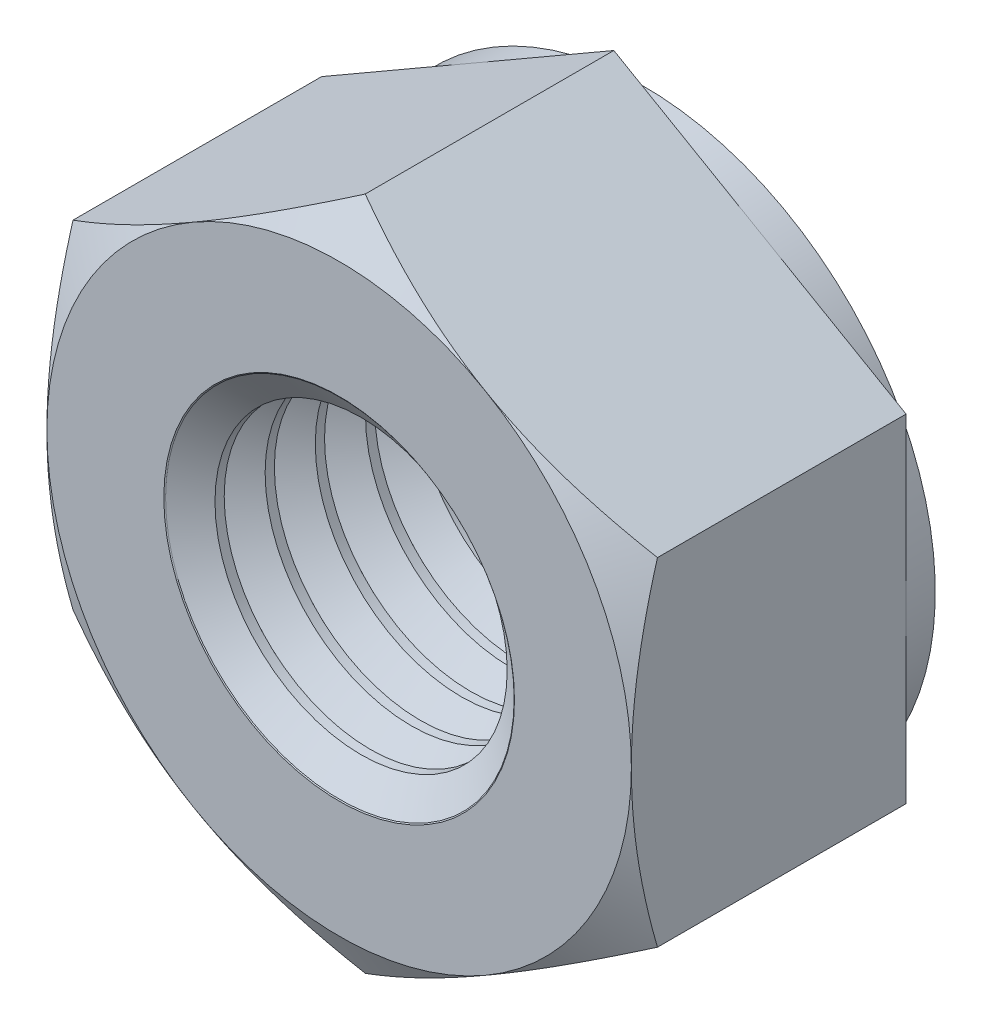
ISO-10303-21;
HEADER;
FILE_DESCRIPTION(('STEP AP214'),'2;1');
FILE_NAME('part.step','',(''),(''),'','','');
FILE_SCHEMA(('AUTOMOTIVE_DESIGN { 1 0 10303 214 1 1 1 1 }'));
ENDSEC;
DATA;
#1=APPLICATION_CONTEXT('core data for automotive mechanical design processes');
#2=APPLICATION_PROTOCOL_DEFINITION('international standard','automotive_design',2000,#1);
#3=PRODUCT_CONTEXT('',#1,'mechanical');
#4=PRODUCT('Part','Part','',(#3));
#5=PRODUCT_RELATED_PRODUCT_CATEGORY('part','',(#4));
#6=PRODUCT_DEFINITION_FORMATION('','',#4);
#7=PRODUCT_DEFINITION_CONTEXT('part definition',#1,'design');
#8=PRODUCT_DEFINITION('design','',#6,#7);
#9=PRODUCT_DEFINITION_SHAPE('','',#8);
#10=(LENGTH_UNIT() NAMED_UNIT(*) SI_UNIT(.MILLI.,.METRE.));
#11=(NAMED_UNIT(*) PLANE_ANGLE_UNIT() SI_UNIT($,.RADIAN.));
#12=(NAMED_UNIT(*) SI_UNIT($,.STERADIAN.) SOLID_ANGLE_UNIT());
#13=UNCERTAINTY_MEASURE_WITH_UNIT(LENGTH_MEASURE(1.E-05),#10,'distance_accuracy_value','');
#14=(GEOMETRIC_REPRESENTATION_CONTEXT(3) GLOBAL_UNCERTAINTY_ASSIGNED_CONTEXT((#13)) GLOBAL_UNIT_ASSIGNED_CONTEXT((#10,
#11,#12)) REPRESENTATION_CONTEXT('',''));
#15=CARTESIAN_POINT('',(0.,0.,0.));
#16=DIRECTION('',(0.,0.,1.));
#17=DIRECTION('',(1.,0.,0.));
#18=AXIS2_PLACEMENT_3D('',#15,#16,#17);
#19=CARTESIAN_POINT('',(0.,0.,-5.2));
#20=DIRECTION('',(0.,0.,1.));
#21=DIRECTION('',(1.,0.,0.));
#22=AXIS2_PLACEMENT_3D('',#19,#20,#21);
#23=CYLINDRICAL_SURFACE('',#22,2.5);
#24=CARTESIAN_POINT('',(0.,0.,-4.66650376910486));
#25=DIRECTION('',(0.,0.,-1.));
#26=DIRECTION('',(-1.,0.,0.));
#27=AXIS2_PLACEMENT_3D('',#24,#25,#26);
#28=CIRCLE('',#27,2.5);
#29=CARTESIAN_POINT('',(-2.5,0.,-4.66650376910486));
#30=VERTEX_POINT('',#29);
#31=EDGE_CURVE('E745',#30,#30,#28,.T.);
#32=ORIENTED_EDGE('',*,*,#31,.F.);
#33=EDGE_LOOP('',(#32));
#34=FACE_BOUND('',#33,.T.);
#35=CARTESIAN_POINT('',(0.,0.,-4.82449623089515));
#36=DIRECTION('',(0.,0.,-1.));
#37=DIRECTION('',(-1.,0.,0.));
#38=AXIS2_PLACEMENT_3D('',#35,#36,#37);
#39=CIRCLE('',#38,2.5);
#40=CARTESIAN_POINT('',(-2.5,0.,-4.82449623089515));
#41=VERTEX_POINT('',#40);
#42=EDGE_CURVE('E287',#41,#41,#39,.F.);
#43=ORIENTED_EDGE('',*,*,#42,.F.);
#44=EDGE_LOOP('',(#43));
#45=FACE_BOUND('',#44,.T.);
#46=ADVANCED_FACE('F41',(#34,#45),#23,.F.);
#47=CARTESIAN_POINT('',(0.,0.,-3.96629623089515));
#48=DIRECTION('',(0.,0.,-1.));
#49=DIRECTION('',(-1.,0.,0.));
#50=AXIS2_PLACEMENT_3D('',#47,#48,#49);
#51=CIRCLE('',#50,2.5);
#52=CARTESIAN_POINT('',(-2.5,0.,-3.96629623089515));
#53=VERTEX_POINT('',#52);
#54=EDGE_CURVE('E746',#53,#53,#51,.T.);
#55=ORIENTED_EDGE('',*,*,#54,.T.);
#56=EDGE_LOOP('',(#55));
#57=FACE_BOUND('',#56,.T.);
#58=CARTESIAN_POINT('',(0.,0.,-3.80830376910486));
#59=DIRECTION('',(0.,0.,-1.));
#60=DIRECTION('',(-1.,0.,0.));
#61=AXIS2_PLACEMENT_3D('',#58,#59,#60);
#62=CIRCLE('',#61,2.5);
#63=CARTESIAN_POINT('',(-2.5,0.,-3.80830376910486));
#64=VERTEX_POINT('',#63);
#65=EDGE_CURVE('E755',#64,#64,#62,.T.);
#66=ORIENTED_EDGE('',*,*,#65,.F.);
#67=EDGE_LOOP('',(#66));
#68=FACE_BOUND('',#67,.T.);
#69=ADVANCED_FACE('F241',(#57,#68),#23,.F.);
#70=CARTESIAN_POINT('',(0.,0.,-3.10809623089515));
#71=DIRECTION('',(0.,0.,-1.));
#72=DIRECTION('',(-1.,0.,0.));
#73=AXIS2_PLACEMENT_3D('',#70,#71,#72);
#74=CIRCLE('',#73,2.5);
#75=CARTESIAN_POINT('',(-2.5,0.,-3.10809623089515));
#76=VERTEX_POINT('',#75);
#77=EDGE_CURVE('E748',#76,#76,#74,.T.);
#78=ORIENTED_EDGE('',*,*,#77,.T.);
#79=EDGE_LOOP('',(#78));
#80=FACE_BOUND('',#79,.T.);
#81=CARTESIAN_POINT('',(0.,0.,-2.95010376910486));
#82=DIRECTION('',(0.,0.,-1.));
#83=DIRECTION('',(-1.,0.,0.));
#84=AXIS2_PLACEMENT_3D('',#81,#82,#83);
#85=CIRCLE('',#84,2.5);
#86=CARTESIAN_POINT('',(-2.5,0.,-2.95010376910486));
#87=VERTEX_POINT('',#86);
#88=EDGE_CURVE('E764',#87,#87,#85,.T.);
#89=ORIENTED_EDGE('',*,*,#88,.F.);
#90=EDGE_LOOP('',(#89));
#91=FACE_BOUND('',#90,.T.);
#92=ADVANCED_FACE('F248',(#80,#91),#23,.F.);
#93=CARTESIAN_POINT('',(0.,0.,-2.24989623089515));
#94=DIRECTION('',(0.,0.,-1.));
#95=DIRECTION('',(-1.,0.,0.));
#96=AXIS2_PLACEMENT_3D('',#93,#94,#95);
#97=CIRCLE('',#96,2.5);
#98=CARTESIAN_POINT('',(-2.5,0.,-2.24989623089515));
#99=VERTEX_POINT('',#98);
#100=EDGE_CURVE('E761',#99,#99,#97,.T.);
#101=ORIENTED_EDGE('',*,*,#100,.T.);
#102=EDGE_LOOP('',(#101));
#103=FACE_BOUND('',#102,.T.);
#104=CARTESIAN_POINT('',(0.,0.,-2.09190376910486));
#105=DIRECTION('',(0.,0.,-1.));
#106=DIRECTION('',(-1.,0.,0.));
#107=AXIS2_PLACEMENT_3D('',#104,#105,#106);
#108=CIRCLE('',#107,2.5);
#109=CARTESIAN_POINT('',(-2.5,0.,-2.09190376910486));
#110=VERTEX_POINT('',#109);
#111=EDGE_CURVE('E773',#110,#110,#108,.T.);
#112=ORIENTED_EDGE('',*,*,#111,.F.);
#113=EDGE_LOOP('',(#112));
#114=FACE_BOUND('',#113,.T.);
#115=ADVANCED_FACE('F262',(#103,#114),#23,.F.);
#116=CARTESIAN_POINT('',(0.,0.,-1.39169623089515));
#117=DIRECTION('',(0.,0.,-1.));
#118=DIRECTION('',(-1.,0.,0.));
#119=AXIS2_PLACEMENT_3D('',#116,#117,#118);
#120=CIRCLE('',#119,2.5);
#121=CARTESIAN_POINT('',(-2.5,0.,-1.39169623089515));
#122=VERTEX_POINT('',#121);
#123=EDGE_CURVE('E770',#122,#122,#120,.T.);
#124=ORIENTED_EDGE('',*,*,#123,.T.);
#125=EDGE_LOOP('',(#124));
#126=FACE_BOUND('',#125,.T.);
#127=CARTESIAN_POINT('',(0.,0.,-1.23370376910486));
#128=DIRECTION('',(0.,0.,-1.));
#129=DIRECTION('',(-1.,0.,0.));
#130=AXIS2_PLACEMENT_3D('',#127,#128,#129);
#131=CIRCLE('',#130,2.5);
#132=CARTESIAN_POINT('',(-2.5,0.,-1.23370376910486));
#133=VERTEX_POINT('',#132);
#134=EDGE_CURVE('E278',#133,#133,#131,.T.);
#135=ORIENTED_EDGE('',*,*,#134,.F.);
#136=EDGE_LOOP('',(#135));
#137=FACE_BOUND('',#136,.T.);
#138=ADVANCED_FACE('F254',(#126,#137),#23,.F.);
#139=CARTESIAN_POINT('',(0.,0.,-0.533496230895153));
#140=DIRECTION('',(0.,0.,-1.));
#141=DIRECTION('',(-1.,0.,0.));
#142=AXIS2_PLACEMENT_3D('',#139,#140,#141);
#143=CIRCLE('',#142,2.5);
#144=CARTESIAN_POINT('',(-2.5,0.,-0.533496230895153));
#145=VERTEX_POINT('',#144);
#146=EDGE_CURVE('E267',#145,#145,#143,.T.);
#147=ORIENTED_EDGE('',*,*,#146,.T.);
#148=EDGE_LOOP('',(#147));
#149=FACE_BOUND('',#148,.T.);
#150=CARTESIAN_POINT('',(0.,0.,-0.375503769104859));
#151=DIRECTION('',(0.,0.,-1.));
#152=DIRECTION('',(-1.,0.,0.));
#153=AXIS2_PLACEMENT_3D('',#150,#151,#152);
#154=CIRCLE('',#153,2.5);
#155=CARTESIAN_POINT('',(-2.5,0.,-0.375503769104859));
#156=VERTEX_POINT('',#155);
#157=EDGE_CURVE('E270',#156,#156,#154,.T.);
#158=ORIENTED_EDGE('',*,*,#157,.F.);
#159=EDGE_LOOP('',(#158));
#160=FACE_BOUND('',#159,.T.);
#161=ADVANCED_FACE('F244',(#149,#160),#23,.F.);
#162=CARTESIAN_POINT('',(0.,5.77350269189626,-5.2));
#163=DIRECTION('',(-0.500000000000001,0.866025403784438,0.));
#164=DIRECTION('',(-0.866025403784438,-0.500000000000001,0.));
#165=AXIS2_PLACEMENT_3D('',#162,#163,#164);
#166=PLANE('',#165);
#167=DIRECTION('',(0.,0.,1.));
#168=VECTOR('',#167,1.);
#169=CARTESIAN_POINT('',(-5.,2.88675134594813,-5.2));
#170=LINE('',#169,#168);
#171=CARTESIAN_POINT('',(-5.,2.88675134594813,-4.7));
#172=VERTEX_POINT('',#171);
#173=CARTESIAN_POINT('',(-5.,2.88675134594813,-0.446581987385209));
#174=VERTEX_POINT('',#173);
#175=EDGE_CURVE('E304',#172,#174,#170,.T.);
#176=ORIENTED_EDGE('',*,*,#175,.T.);
#177=CARTESIAN_POINT('',(-5.0002,2.88663587589429,-0.446648656051831));
#178=CARTESIAN_POINT('',(-4.78046540547482,3.01349970319368,-0.373386567637636));
#179=CARTESIAN_POINT('',(-4.55885141554042,3.14144859993849,-0.306751321918093));
#180=CARTESIAN_POINT('',(-4.11178600454649,3.39956193532121,-0.190438991010811));
#181=CARTESIAN_POINT('',(-3.88632664040923,3.52973095989718,-0.140803049915789));
#182=CARTESIAN_POINT('',(-3.43816769477649,3.78847564779797,-0.063551025418698));
#183=CARTESIAN_POINT('',(-3.21553790689581,3.91701101576052,-0.0354203782834891));
#184=CARTESIAN_POINT('',(-2.88081009815336,4.11026620624322,-0.0101949219536841));
#185=CARTESIAN_POINT('',(-2.76915780319494,4.17472868879311,-0.0046134597694836));
#186=CARTESIAN_POINT('',(-2.5457500293262,4.30371322717528,0.000797783248529989));
#187=CARTESIAN_POINT('',(-2.43399455370969,4.36823528110589,0.000627741741796701));
#188=CARTESIAN_POINT('',(-2.12781576914936,4.54500768479194,-0.00775363179203703));
#189=CARTESIAN_POINT('',(-1.93349391403279,4.65719946015293,-0.0218297718972527));
#190=CARTESIAN_POINT('',(-1.54613989800229,4.88083840557982,-0.0664652571094329));
#191=CARTESIAN_POINT('',(-1.35310909862843,4.99228478956021,-0.0970398601475103));
#192=CARTESIAN_POINT('',(-0.964974657525144,5.21637431361295,-0.173468493621167));
#193=CARTESIAN_POINT('',(-0.769920001358263,5.32898917185759,-0.219646378878684));
#194=CARTESIAN_POINT('',(-0.38271965464123,5.55253939626499,-0.32445179449194));
#195=CARTESIAN_POINT('',(-0.190569004591911,5.66347762579592,-0.38305470343738));
#196=CARTESIAN_POINT('',(0.000200000000001904,5.7736181619501,-0.446648656051835));
#197=B_SPLINE_CURVE_WITH_KNOTS('',3,(#177,#178,#179,#180,#181,#182,#183,#184,#185,#186,#187,
#188,#189,#190,#191,#192,#193,#194,#195,#196),.UNSPECIFIED.,.F.,.F.,(4,2,2,2,2,2,2,2,2,4),(0.,
0.792555841363091,1.58701660053334,2.36181537487281,2.74884076077326,3.13585419177295,
3.8096236259968,4.4840172390119,5.17336882348929,5.86136694793726),.UNSPECIFIED.);
#198=CARTESIAN_POINT('',(-2.50000000000001,4.33012701892219,0.));
#199=VERTEX_POINT('',#198);
#200=EDGE_CURVE('E65',#174,#199,#197,.T.);
#201=ORIENTED_EDGE('',*,*,#200,.T.);
#202=CARTESIAN_POINT('',(0.,5.77350269189627,-0.446581987385209));
#203=VERTEX_POINT('',#202);
#204=EDGE_CURVE('E172',#199,#203,#197,.T.);
#205=ORIENTED_EDGE('',*,*,#204,.T.);
#206=DIRECTION('',(0.,0.,1.));
#207=VECTOR('',#206,1.);
#208=CARTESIAN_POINT('',(0.,5.77350269189626,-5.2));
#209=LINE('',#208,#207);
#210=CARTESIAN_POINT('',(0.,5.77350269189626,-4.7));
#211=VERTEX_POINT('',#210);
#212=EDGE_CURVE('E303',#211,#203,#209,.T.);
#213=ORIENTED_EDGE('',*,*,#212,.F.);
#214=DIRECTION('',(-0.866025403784438,-0.500000000000001,0.));
#215=VECTOR('',#214,1.);
#216=CARTESIAN_POINT('',(0.,5.77350269189626,-4.7));
#217=LINE('',#216,#215);
#218=CARTESIAN_POINT('',(-2.50000000000001,4.33012701892219,-4.7));
#219=VERTEX_POINT('',#218);
#220=EDGE_CURVE('E332',#211,#219,#217,.T.);
#221=ORIENTED_EDGE('',*,*,#220,.T.);
#222=EDGE_CURVE('E329',#219,#172,#217,.T.);
#223=ORIENTED_EDGE('',*,*,#222,.T.);
#224=EDGE_LOOP('',(#176,#201,#205,#213,#221,#223));
#225=FACE_BOUND('',#224,.T.);
#226=ADVANCED_FACE('F43',(#225),#166,.T.);
#227=CARTESIAN_POINT('',(5.,2.88675134594812,-5.2));
#228=DIRECTION('',(0.500000000000002,0.866025403784438,0.));
#229=DIRECTION('',(-0.866025403784438,0.500000000000002,0.));
#230=AXIS2_PLACEMENT_3D('',#227,#228,#229);
#231=PLANE('',#230);
#232=ORIENTED_EDGE('',*,*,#212,.T.);
#233=CARTESIAN_POINT('',(-0.000199999999998365,5.7736181619501,-0.446648656051835));
#234=CARTESIAN_POINT('',(0.219534594525187,5.64675433465071,-0.37338656763764));
#235=CARTESIAN_POINT('',(0.441148584459582,5.5188054379059,-0.306751321918097));
#236=CARTESIAN_POINT('',(0.888213995453515,5.26069210252318,-0.190438991010814));
#237=CARTESIAN_POINT('',(1.11367335959078,5.13052307794721,-0.140803049915791));
#238=CARTESIAN_POINT('',(1.56183230522351,4.87177839004641,-0.063551025418699));
#239=CARTESIAN_POINT('',(1.78446209310419,4.74324302208387,-0.0354203782834898));
#240=CARTESIAN_POINT('',(2.11918990184664,4.54998783160116,-0.0101949219536843));
#241=CARTESIAN_POINT('',(2.23084219680506,4.48552534905128,-0.00461345976948365));
#242=CARTESIAN_POINT('',(2.4542499706738,4.35654081066911,0.000797783248530284));
#243=CARTESIAN_POINT('',(2.56600544629032,4.2920187567385,0.000627741741797194));
#244=CARTESIAN_POINT('',(2.87218423085064,4.11524635305244,-0.00775363179203582));
#245=CARTESIAN_POINT('',(3.06650608596722,4.00305457769146,-0.0218297718972508));
#246=CARTESIAN_POINT('',(3.45386010199771,3.77941563226457,-0.0664652571094301));
#247=CARTESIAN_POINT('',(3.64689090137157,3.66796924828418,-0.0970398601475074));
#248=CARTESIAN_POINT('',(4.03502534247485,3.44387972423143,-0.173468493621163));
#249=CARTESIAN_POINT('',(4.23007999864174,3.33126486598679,-0.21964637887868));
#250=CARTESIAN_POINT('',(4.61728034535877,3.1077146415794,-0.324451794491934));
#251=CARTESIAN_POINT('',(4.80943099540809,2.99677641204846,-0.383054703437374));
#252=CARTESIAN_POINT('',(5.0002,2.88663587589428,-0.446648656051829));
#253=B_SPLINE_CURVE_WITH_KNOTS('',3,(#233,#234,#235,#236,#237,#238,#239,#240,#241,#242,#243,
#244,#245,#246,#247,#248,#249,#250,#251,#252),.UNSPECIFIED.,.F.,.F.,(4,2,2,2,2,2,2,2,2,4),(0.,
0.792555841363092,1.58701660053334,2.36181537487281,2.74884076077326,3.13585419177296,
3.8096236259968,4.4840172390119,5.17336882348929,5.86136694793726),.UNSPECIFIED.);
#254=CARTESIAN_POINT('',(2.50000000000001,4.33012701892219,0.));
#255=VERTEX_POINT('',#254);
#256=EDGE_CURVE('E169',#203,#255,#253,.T.);
#257=ORIENTED_EDGE('',*,*,#256,.T.);
#258=CARTESIAN_POINT('',(5.,2.88675134594814,-0.446581987385209));
#259=VERTEX_POINT('',#258);
#260=EDGE_CURVE('E152',#255,#259,#253,.T.);
#261=ORIENTED_EDGE('',*,*,#260,.T.);
#262=DIRECTION('',(0.,0.,1.));
#263=VECTOR('',#262,1.);
#264=CARTESIAN_POINT('',(5.,2.88675134594812,-5.2));
#265=LINE('',#264,#263);
#266=CARTESIAN_POINT('',(5.,2.88675134594812,-4.7));
#267=VERTEX_POINT('',#266);
#268=EDGE_CURVE('E168',#267,#259,#265,.T.);
#269=ORIENTED_EDGE('',*,*,#268,.F.);
#270=DIRECTION('',(-0.866025403784438,0.500000000000002,0.));
#271=VECTOR('',#270,1.);
#272=CARTESIAN_POINT('',(5.,2.88675134594812,-4.7));
#273=LINE('',#272,#271);
#274=CARTESIAN_POINT('',(2.50000000000001,4.33012701892219,-4.7));
#275=VERTEX_POINT('',#274);
#276=EDGE_CURVE('E324',#267,#275,#273,.T.);
#277=ORIENTED_EDGE('',*,*,#276,.T.);
#278=EDGE_CURVE('E321',#275,#211,#273,.T.);
#279=ORIENTED_EDGE('',*,*,#278,.T.);
#280=EDGE_LOOP('',(#232,#257,#261,#269,#277,#279));
#281=FACE_BOUND('',#280,.T.);
#282=ADVANCED_FACE('F260',(#281),#231,.T.);
#283=CARTESIAN_POINT('',(5.,2.88675134594812,-5.2));
#284=DIRECTION('',(-1.,0.,0.));
#285=DIRECTION('',(0.,0.,1.));
#286=AXIS2_PLACEMENT_3D('',#283,#284,#285);
#287=PLANE('',#286);
#288=CARTESIAN_POINT('',(5.,-7.65608998744866,-2.39263352655081));
#289=CARTESIAN_POINT('',(5.,-7.43656171400167,-2.28654533817208));
#290=CARTESIAN_POINT('',(5.,-7.21651440170023,-2.18151175461596));
#291=CARTESIAN_POINT('',(5.,-6.77510105921519,-1.97415643363977));
#292=CARTESIAN_POINT('',(5.,-6.55373480873054,-1.87183516574569));
#293=CARTESIAN_POINT('',(5.,-6.10820714710358,-1.66996807853491));
#294=CARTESIAN_POINT('',(5.,-5.88403698971125,-1.57044149281731));
#295=CARTESIAN_POINT('',(5.,-5.43385418074678,-1.37566323278682));
#296=CARTESIAN_POINT('',(5.,-5.20784162594279,-1.28041133564243));
#297=CARTESIAN_POINT('',(5.,-4.75080884782757,-1.09418830918942));
#298=CARTESIAN_POINT('',(5.,-4.51976121099506,-1.0032840909987));
#299=CARTESIAN_POINT('',(5.,-4.05494053422101,-0.828595302971954));
#300=CARTESIAN_POINT('',(5.,-3.82116719434025,-0.744811525247656));
#301=CARTESIAN_POINT('',(5.,-3.3510041671189,-0.586614632364622));
#302=CARTESIAN_POINT('',(5.,-3.11462125088189,-0.512181595225274));
#303=CARTESIAN_POINT('',(5.,-2.63849247870024,-0.37510439387238));
#304=CARTESIAN_POINT('',(5.,-2.39874771210331,-0.312456501596952));
#305=CARTESIAN_POINT('',(5.,-1.91574303714498,-0.201987753994871));
#306=CARTESIAN_POINT('',(5.,-1.67248221084101,-0.154170846558643));
#307=CARTESIAN_POINT('',(5.,-1.18299359688665,-0.0765955557924036));
#308=CARTESIAN_POINT('',(5.,-0.936765806613288,-0.0468371884284104));
#309=CARTESIAN_POINT('',(5.,-0.567032279323855,-0.0176512015862972));
#310=CARTESIAN_POINT('',(5.,-0.444105297658547,-0.0104963190599475));
#311=CARTESIAN_POINT('',(5.,-0.198053005238572,-0.00139545226904099));
#312=CARTESIAN_POINT('',(5.,-0.0749276970802352,0.000550599639614439));
#313=CARTESIAN_POINT('',(5.,0.171257999892347,-0.000818470345663825));
#314=CARTESIAN_POINT('',(5.,0.294318397227082,-0.00413211431301123));
#315=CARTESIAN_POINT('',(5.,0.540192730788835,-0.0159365972827595));
#316=CARTESIAN_POINT('',(5.,0.663006654263478,-0.0244276975701646));
#317=CARTESIAN_POINT('',(5.,0.960681872881662,-0.0511063802753004));
#318=CARTESIAN_POINT('',(5.,1.13531436279939,-0.0718889676982857));
#319=CARTESIAN_POINT('',(5.,1.48321675799388,-0.122765655722694));
#320=CARTESIAN_POINT('',(5.,1.65648647841236,-0.152860997990033));
#321=CARTESIAN_POINT('',(5.,2.00155426058698,-0.22129879201155));
#322=CARTESIAN_POINT('',(5.,2.17335067370372,-0.259649477486403));
#323=CARTESIAN_POINT('',(5.,2.51518168221053,-0.343428305385009));
#324=CARTESIAN_POINT('',(5.,2.6852163841931,-0.388856016913999));
#325=CARTESIAN_POINT('',(5.,3.02770318928891,-0.48688778205429));
#326=CARTESIAN_POINT('',(5.,3.20011248435311,-0.539640363823939));
#327=CARTESIAN_POINT('',(5.,3.54310870430176,-0.650357787302623));
#328=CARTESIAN_POINT('',(5.,3.71369679659714,-0.708319033907067));
#329=CARTESIAN_POINT('',(5.,4.05236610267973,-0.828256540728471));
#330=CARTESIAN_POINT('',(5.,4.22045602230055,-0.890208365426362));
#331=CARTESIAN_POINT('',(5.,4.55533171687447,-1.01774823413812));
#332=CARTESIAN_POINT('',(5.,4.72211693321414,-1.08333774778777));
#333=CARTESIAN_POINT('',(5.,4.88829623733354,-1.15038625817724));
#334=B_SPLINE_CURVE_WITH_KNOTS('',3,(#288,#289,#290,#291,#292,#293,#294,#295,#296,#297,#298,
#299,#300,#301,#302,#303,#304,#305,#306,#307,#308,#309,#310,#311,#312,#313,#314,#315,#316,#317,
#318,#319,#320,#321,#322,#323,#324,#325,#326,#327,#328,#329,#330,#331,#332,#333),.UNSPECIFIED.,
.F.,.F.,(4,2,2,2,2,2,2,2,2,2,2,2,2,2,2,2,2,2,2,2,2,2,4),(0.,0.731464740665352,1.46305528824909,
2.19883243307486,2.93457117856034,3.67934251246858,4.42419659013362,5.1674358087199,
5.91043951739339,6.65364083834807,7.39684281638516,7.76615414335457,8.13546067426611,
8.50466345177857,8.87388486298453,9.40118542949728,9.92855633110015,10.4564556797854,
10.9843228991235,11.525120280828,12.065547221064,12.6029322754131,13.1405360390026),.UNSPECIFIED.);
#335=CARTESIAN_POINT('',(5.,-2.88675134594814,-0.446581987385209));
#336=VERTEX_POINT('',#335);
#337=CARTESIAN_POINT('',(5.,0.,0.));
#338=VERTEX_POINT('',#337);
#339=EDGE_CURVE('E133',#336,#338,#334,.T.);
#340=ORIENTED_EDGE('',*,*,#339,.F.);
#341=DIRECTION('',(0.,0.,1.));
#342=VECTOR('',#341,1.);
#343=CARTESIAN_POINT('',(5.,-2.88675134594814,-5.2));
#344=LINE('',#343,#342);
#345=CARTESIAN_POINT('',(5.,-2.88675134594814,-4.7));
#346=VERTEX_POINT('',#345);
#347=EDGE_CURVE('E313',#346,#336,#344,.T.);
#348=ORIENTED_EDGE('',*,*,#347,.F.);
#349=DIRECTION('',(0.,-1.,0.));
#350=VECTOR('',#349,1.);
#351=CARTESIAN_POINT('',(5.,2.88675134594812,-4.7));
#352=LINE('',#351,#350);
#353=CARTESIAN_POINT('',(5.,0.,-4.7));
#354=VERTEX_POINT('',#353);
#355=EDGE_CURVE('E318',#354,#346,#352,.T.);
#356=ORIENTED_EDGE('',*,*,#355,.F.);
#357=EDGE_CURVE('E308',#267,#354,#352,.T.);
#358=ORIENTED_EDGE('',*,*,#357,.F.);
#359=ORIENTED_EDGE('',*,*,#268,.T.);
#360=EDGE_CURVE('E146',#338,#259,#334,.T.);
#361=ORIENTED_EDGE('',*,*,#360,.F.);
#362=EDGE_LOOP('',(#340,#348,#356,#358,#359,#361));
#363=FACE_BOUND('',#362,.T.);
#364=ADVANCED_FACE('F165',(#363),#287,.F.);
#365=CARTESIAN_POINT('',(0.,-5.77350269189628,-5.2));
#366=DIRECTION('',(0.500000000000001,-0.866025403784438,0.));
#367=DIRECTION('',(0.866025403784438,0.500000000000001,0.));
#368=AXIS2_PLACEMENT_3D('',#365,#366,#367);
#369=PLANE('',#368);
#370=ORIENTED_EDGE('',*,*,#347,.T.);
#371=CARTESIAN_POINT('',(5.0002,-2.8866358758943,-0.446648656051835));
#372=CARTESIAN_POINT('',(4.78046540547481,-3.01349970319369,-0.37338656763764));
#373=CARTESIAN_POINT('',(4.55885141554042,-3.1414485999385,-0.306751321918097));
#374=CARTESIAN_POINT('',(4.11178600454648,-3.39956193532122,-0.190438991010816));
#375=CARTESIAN_POINT('',(3.88632664040922,-3.52973095989719,-0.140803049915795));
#376=CARTESIAN_POINT('',(3.43816769477649,-3.78847564779799,-0.0635510254187038));
#377=CARTESIAN_POINT('',(3.2155379068958,-3.91701101576053,-0.0354203782834952));
#378=CARTESIAN_POINT('',(2.88081009815335,-4.11026620624324,-0.0101949219536908));
#379=CARTESIAN_POINT('',(2.76915780319493,-4.17472868879312,-0.00461345976949053));
#380=CARTESIAN_POINT('',(2.5457500293262,-4.3037132271753,0.000797783248522405));
#381=CARTESIAN_POINT('',(2.43399455370968,-4.36823528110591,0.000627741741788657));
#382=CARTESIAN_POINT('',(2.12781576914936,-4.54500768479196,-0.00775363179204565));
#383=CARTESIAN_POINT('',(1.93349391403278,-4.65719946015294,-0.0218297718972608));
#384=CARTESIAN_POINT('',(1.54613989800229,-4.88083840557983,-0.0664652571094409));
#385=CARTESIAN_POINT('',(1.35310909862843,-4.99228478956022,-0.0970398601475188));
#386=CARTESIAN_POINT('',(0.964974657525142,-5.21637431361297,-0.173468493621175));
#387=CARTESIAN_POINT('',(0.769920001358261,-5.32898917185761,-0.219646378878692));
#388=CARTESIAN_POINT('',(0.382719654641229,-5.552539396265,-0.324451794491947));
#389=CARTESIAN_POINT('',(0.190569004591912,-5.66347762579594,-0.383054703437388));
#390=CARTESIAN_POINT('',(-0.000200000000001389,-5.77361816195012,-0.446648656051843));
#391=B_SPLINE_CURVE_WITH_KNOTS('',3,(#371,#372,#373,#374,#375,#376,#377,#378,#379,#380,#381,
#382,#383,#384,#385,#386,#387,#388,#389,#390),.UNSPECIFIED.,.F.,.F.,(4,2,2,2,2,2,2,2,2,4),(0.,
0.792555841363093,1.58701660053334,2.36181537487281,2.74884076077326,3.13585419177296,
3.8096236259968,4.4840172390119,5.17336882348929,5.86136694793726),.UNSPECIFIED.);
#392=CARTESIAN_POINT('',(2.5,-4.33012701892219,0.));
#393=VERTEX_POINT('',#392);
#394=EDGE_CURVE('E140',#336,#393,#391,.T.);
#395=ORIENTED_EDGE('',*,*,#394,.T.);
#396=CARTESIAN_POINT('',(0.,-5.77350269189627,-0.446581987385209));
#397=VERTEX_POINT('',#396);
#398=EDGE_CURVE('E180',#393,#397,#391,.T.);
#399=ORIENTED_EDGE('',*,*,#398,.T.);
#400=DIRECTION('',(0.,0.,1.));
#401=VECTOR('',#400,1.);
#402=CARTESIAN_POINT('',(0.,-5.77350269189628,-5.2));
#403=LINE('',#402,#401);
#404=CARTESIAN_POINT('',(0.,-5.77350269189628,-4.7));
#405=VERTEX_POINT('',#404);
#406=EDGE_CURVE('E310',#405,#397,#403,.T.);
#407=ORIENTED_EDGE('',*,*,#406,.F.);
#408=DIRECTION('',(0.866025403784438,0.500000000000001,0.));
#409=VECTOR('',#408,1.);
#410=CARTESIAN_POINT('',(0.,-5.77350269189628,-4.7));
#411=LINE('',#410,#409);
#412=CARTESIAN_POINT('',(2.50000000000001,-4.3301270189222,-4.7));
#413=VERTEX_POINT('',#412);
#414=EDGE_CURVE('E325',#405,#413,#411,.T.);
#415=ORIENTED_EDGE('',*,*,#414,.T.);
#416=EDGE_CURVE('E320',#413,#346,#411,.T.);
#417=ORIENTED_EDGE('',*,*,#416,.T.);
#418=EDGE_LOOP('',(#370,#395,#399,#407,#415,#417));
#419=FACE_BOUND('',#418,.T.);
#420=ADVANCED_FACE('F227',(#419),#369,.T.);
#421=CARTESIAN_POINT('',(-5.,-2.88675134594814,-5.2));
#422=DIRECTION('',(-0.500000000000002,-0.866025403784438,0.));
#423=DIRECTION('',(0.866025403784438,-0.500000000000002,0.));
#424=AXIS2_PLACEMENT_3D('',#421,#422,#423);
#425=PLANE('',#424);
#426=ORIENTED_EDGE('',*,*,#406,.T.);
#427=CARTESIAN_POINT('',(0.000199999999998596,-5.77361816195012,-0.446648656051843));
#428=CARTESIAN_POINT('',(-0.219534594525187,-5.64675433465073,-0.373386567637648));
#429=CARTESIAN_POINT('',(-0.441148584459583,-5.51880543790592,-0.306751321918105));
#430=CARTESIAN_POINT('',(-0.888213995453517,-5.26069210252319,-0.190438991010821));
#431=CARTESIAN_POINT('',(-1.11367335959078,-5.13052307794722,-0.140803049915798));
#432=CARTESIAN_POINT('',(-1.56183230522352,-4.87177839004642,-0.0635510254187059));
#433=CARTESIAN_POINT('',(-1.7844620931042,-4.74324302208388,-0.0354203782834969));
#434=CARTESIAN_POINT('',(-2.11918990184665,-4.54998783160117,-0.0101949219536912));
#435=CARTESIAN_POINT('',(-2.23084219680507,-4.48552534905129,-0.00461345976949037));
#436=CARTESIAN_POINT('',(-2.45424997067381,-4.35654081066912,0.000797783248523488));
#437=CARTESIAN_POINT('',(-2.56600544629032,-4.29201875673851,0.000627741741790118));
#438=CARTESIAN_POINT('',(-2.87218423085065,-4.11524635305245,-0.00775363179204337));
#439=CARTESIAN_POINT('',(-3.06650608596722,-4.00305457769147,-0.0218297718972583));
#440=CARTESIAN_POINT('',(-3.45386010199771,-3.77941563226458,-0.066465257109437));
#441=CARTESIAN_POINT('',(-3.64689090137158,-3.66796924828419,-0.0970398601475137));
#442=CARTESIAN_POINT('',(-4.03502534247486,-3.44387972423145,-0.173468493621169));
#443=CARTESIAN_POINT('',(-4.23007999864174,-3.33126486598681,-0.219646378878685));
#444=CARTESIAN_POINT('',(-4.61728034535877,-3.10771464157941,-0.324451794491939));
#445=CARTESIAN_POINT('',(-4.80943099540809,-2.99677641204848,-0.383054703437379));
#446=CARTESIAN_POINT('',(-5.0002,-2.8866358758943,-0.446648656051833));
#447=B_SPLINE_CURVE_WITH_KNOTS('',3,(#427,#428,#429,#430,#431,#432,#433,#434,#435,#436,#437,
#438,#439,#440,#441,#442,#443,#444,#445,#446),.UNSPECIFIED.,.F.,.F.,(4,2,2,2,2,2,2,2,2,4),(0.,
0.792555841363094,1.58701660053334,2.36181537487282,2.74884076077327,3.13585419177296,
3.8096236259968,4.4840172390119,5.17336882348929,5.86136694793726),.UNSPECIFIED.);
#448=CARTESIAN_POINT('',(-2.50000000000001,-4.33012701892219,0.));
#449=VERTEX_POINT('',#448);
#450=EDGE_CURVE('E221',#397,#449,#447,.T.);
#451=ORIENTED_EDGE('',*,*,#450,.T.);
#452=CARTESIAN_POINT('',(-5.,-2.88675134594814,-0.446581987385209));
#453=VERTEX_POINT('',#452);
#454=EDGE_CURVE('E213',#449,#453,#447,.T.);
#455=ORIENTED_EDGE('',*,*,#454,.T.);
#456=DIRECTION('',(0.,0.,1.));
#457=VECTOR('',#456,1.);
#458=CARTESIAN_POINT('',(-5.,-2.88675134594814,-5.2));
#459=LINE('',#458,#457);
#460=CARTESIAN_POINT('',(-5.,-2.88675134594814,-4.7));
#461=VERTEX_POINT('',#460);
#462=EDGE_CURVE('E307',#461,#453,#459,.T.);
#463=ORIENTED_EDGE('',*,*,#462,.F.);
#464=DIRECTION('',(0.866025403784438,-0.500000000000002,0.));
#465=VECTOR('',#464,1.);
#466=CARTESIAN_POINT('',(-5.,-2.88675134594814,-4.7));
#467=LINE('',#466,#465);
#468=CARTESIAN_POINT('',(-2.50000000000002,-4.3301270189222,-4.7));
#469=VERTEX_POINT('',#468);
#470=EDGE_CURVE('E333',#461,#469,#467,.T.);
#471=ORIENTED_EDGE('',*,*,#470,.T.);
#472=EDGE_CURVE('E328',#469,#405,#467,.T.);
#473=ORIENTED_EDGE('',*,*,#472,.T.);
#474=EDGE_LOOP('',(#426,#451,#455,#463,#471,#473));
#475=FACE_BOUND('',#474,.T.);
#476=ADVANCED_FACE('F223',(#475),#425,.T.);
#477=CARTESIAN_POINT('',(-5.,2.88675134594813,-5.2));
#478=DIRECTION('',(-1.,0.,0.));
#479=DIRECTION('',(0.,0.,1.));
#480=AXIS2_PLACEMENT_3D('',#477,#478,#479);
#481=PLANE('',#480);
#482=ORIENTED_EDGE('',*,*,#462,.T.);
#483=CARTESIAN_POINT('',(-5.,-7.65608998744865,-2.3926335265508));
#484=CARTESIAN_POINT('',(-5.,-7.43656171400166,-2.28654533817208));
#485=CARTESIAN_POINT('',(-5.,-7.21651440170022,-2.18151175461596));
#486=CARTESIAN_POINT('',(-5.,-6.77510105921519,-1.97415643363976));
#487=CARTESIAN_POINT('',(-5.,-6.55373480873053,-1.87183516574569));
#488=CARTESIAN_POINT('',(-5.,-6.10820714710357,-1.66996807853491));
#489=CARTESIAN_POINT('',(-5.,-5.88403698971125,-1.57044149281731));
#490=CARTESIAN_POINT('',(-5.,-5.43385418074677,-1.37566323278682));
#491=CARTESIAN_POINT('',(-5.,-5.20784162594278,-1.28041133564243));
#492=CARTESIAN_POINT('',(-5.,-4.75080884782756,-1.09418830918941));
#493=CARTESIAN_POINT('',(-5.,-4.51976121099505,-1.0032840909987));
#494=CARTESIAN_POINT('',(-5.,-4.054940534221,-0.828595302971951));
#495=CARTESIAN_POINT('',(-5.,-3.82116719434025,-0.744811525247654));
#496=CARTESIAN_POINT('',(-5.,-3.35100416711889,-0.58661463236462));
#497=CARTESIAN_POINT('',(-5.,-3.11462125088188,-0.512181595225272));
#498=CARTESIAN_POINT('',(-5.,-2.63849247870024,-0.375104393872378));
#499=CARTESIAN_POINT('',(-5.,-2.3987477121033,-0.31245650159695));
#500=CARTESIAN_POINT('',(-5.,-1.91574303714497,-0.201987753994869));
#501=CARTESIAN_POINT('',(-5.,-1.672482210841,-0.154170846558642));
#502=CARTESIAN_POINT('',(-5.,-1.18299359688664,-0.0765955557924026));
#503=CARTESIAN_POINT('',(-5.,-0.936765806613282,-0.0468371884284092));
#504=CARTESIAN_POINT('',(-5.,-0.567032279323849,-0.0176512015862963));
#505=CARTESIAN_POINT('',(-5.,-0.444105297658541,-0.0104963190599467));
#506=CARTESIAN_POINT('',(-5.,-0.198053005238567,-0.0013954522690407));
#507=CARTESIAN_POINT('',(-5.,-0.0749276970802303,0.000550599639614488));
#508=CARTESIAN_POINT('',(-5.,0.171257999892351,-0.000818470345663875));
#509=CARTESIAN_POINT('',(-5.,0.294318397227087,-0.00413211431301115));
#510=CARTESIAN_POINT('',(-5.,0.540192730788839,-0.0159365972827596));
#511=CARTESIAN_POINT('',(-5.,0.663006654263483,-0.024427697570165));
#512=CARTESIAN_POINT('',(-5.,0.960681872881666,-0.0511063802753011));
#513=CARTESIAN_POINT('',(-5.,1.1353143627994,-0.0718889676982862));
#514=CARTESIAN_POINT('',(-5.,1.48321675799389,-0.122765655722695));
#515=CARTESIAN_POINT('',(-5.,1.65648647841236,-0.152860997990034));
#516=CARTESIAN_POINT('',(-5.,2.00155426058699,-0.221298792011551));
#517=CARTESIAN_POINT('',(-5.,2.17335067370373,-0.259649477486405));
#518=CARTESIAN_POINT('',(-5.,2.51518168221054,-0.343428305385011));
#519=CARTESIAN_POINT('',(-5.,2.6852163841931,-0.388856016914001));
#520=CARTESIAN_POINT('',(-5.,3.02770318928892,-0.486887782054292));
#521=CARTESIAN_POINT('',(-5.,3.20011248435312,-0.539640363823941));
#522=CARTESIAN_POINT('',(-5.,3.54310870430177,-0.650357787302625));
#523=CARTESIAN_POINT('',(-5.,3.71369679659714,-0.708319033907069));
#524=CARTESIAN_POINT('',(-5.,4.05236610267973,-0.828256540728473));
#525=CARTESIAN_POINT('',(-5.,4.22045602230056,-0.890208365426364));
#526=CARTESIAN_POINT('',(-5.,4.55533171687448,-1.01774823413812));
#527=CARTESIAN_POINT('',(-5.,4.72211693321414,-1.08333774778777));
#528=CARTESIAN_POINT('',(-5.,4.88829623733355,-1.15038625817724));
#529=B_SPLINE_CURVE_WITH_KNOTS('',3,(#483,#484,#485,#486,#487,#488,#489,#490,#491,#492,#493,
#494,#495,#496,#497,#498,#499,#500,#501,#502,#503,#504,#505,#506,#507,#508,#509,#510,#511,#512,
#513,#514,#515,#516,#517,#518,#519,#520,#521,#522,#523,#524,#525,#526,#527,#528),.UNSPECIFIED.,
.F.,.F.,(4,2,2,2,2,2,2,2,2,2,2,2,2,2,2,2,2,2,2,2,2,2,4),(0.,0.731464740665351,1.46305528824909,
2.19883243307486,2.93457117856034,3.67934251246858,4.42419659013362,5.1674358087199,
5.91043951739339,6.65364083834807,7.39684281638516,7.76615414335457,8.13546067426611,
8.50466345177856,8.87388486298453,9.40118542949727,9.92855633110015,10.4564556797854,
10.9843228991235,11.525120280828,12.065547221064,12.6029322754131,13.1405360390026),.UNSPECIFIED.);
#530=CARTESIAN_POINT('',(-5.,0.,0.));
#531=VERTEX_POINT('',#530);
#532=EDGE_CURVE('E222',#453,#531,#529,.T.);
#533=ORIENTED_EDGE('',*,*,#532,.T.);
#534=EDGE_CURVE('E157',#531,#174,#529,.T.);
#535=ORIENTED_EDGE('',*,*,#534,.T.);
#536=ORIENTED_EDGE('',*,*,#175,.F.);
#537=DIRECTION('',(0.,-1.,0.));
#538=VECTOR('',#537,1.);
#539=CARTESIAN_POINT('',(-5.,2.88675134594813,-4.7));
#540=LINE('',#539,#538);
#541=CARTESIAN_POINT('',(-5.,0.,-4.7));
#542=VERTEX_POINT('',#541);
#543=EDGE_CURVE('E296',#172,#542,#540,.T.);
#544=ORIENTED_EDGE('',*,*,#543,.T.);
#545=EDGE_CURVE('E297',#542,#461,#540,.T.);
#546=ORIENTED_EDGE('',*,*,#545,.T.);
#547=EDGE_LOOP('',(#482,#533,#535,#536,#544,#546));
#548=FACE_BOUND('',#547,.T.);
#549=ADVANCED_FACE('F226',(#548),#481,.T.);
#550=CARTESIAN_POINT('',(0.,5.77350269189626,0.));
#551=DIRECTION('',(0.,0.,-1.));
#552=DIRECTION('',(-1.,0.,0.));
#553=AXIS2_PLACEMENT_3D('',#550,#551,#552);
#554=PLANE('',#553);
#555=CARTESIAN_POINT('',(0.,0.,0.));
#556=DIRECTION('',(0.,0.,1.));
#557=DIRECTION('',(1.,0.,0.));
#558=AXIS2_PLACEMENT_3D('',#555,#556,#557);
#559=CIRCLE('',#558,3.);
#560=CARTESIAN_POINT('',(3.,0.,0.));
#561=VERTEX_POINT('',#560);
#562=EDGE_CURVE('E158',#561,#561,#559,.T.);
#563=ORIENTED_EDGE('',*,*,#562,.F.);
#564=EDGE_LOOP('',(#563));
#565=FACE_BOUND('',#564,.T.);
#566=CARTESIAN_POINT('',(0.,0.,0.));
#567=DIRECTION('',(0.,0.,-1.));
#568=DIRECTION('',(-1.,0.,0.));
#569=AXIS2_PLACEMENT_3D('',#566,#567,#568);
#570=CIRCLE('',#569,5.);
#571=EDGE_CURVE('E53',#199,#531,#570,.F.);
#572=ORIENTED_EDGE('',*,*,#571,.T.);
#573=EDGE_CURVE('E12',#531,#449,#570,.F.);
#574=ORIENTED_EDGE('',*,*,#573,.T.);
#575=EDGE_CURVE('E51',#449,#393,#570,.F.);
#576=ORIENTED_EDGE('',*,*,#575,.T.);
#577=EDGE_CURVE('E137',#393,#338,#570,.F.);
#578=ORIENTED_EDGE('',*,*,#577,.T.);
#579=CARTESIAN_POINT('',(0.,0.,0.));
#580=DIRECTION('',(0.,0.,1.));
#581=DIRECTION('',(1.,0.,0.));
#582=AXIS2_PLACEMENT_3D('',#579,#580,#581);
#583=CIRCLE('',#582,5.);
#584=EDGE_CURVE('E149',#338,#255,#583,.T.);
#585=ORIENTED_EDGE('',*,*,#584,.T.);
#586=EDGE_CURVE('E163',#255,#199,#570,.F.);
#587=ORIENTED_EDGE('',*,*,#586,.T.);
#588=EDGE_LOOP('',(#572,#574,#576,#578,#585,#587));
#589=FACE_BOUND('',#588,.T.);
#590=ADVANCED_FACE('F161',(#565,#589),#554,.F.);
#591=CARTESIAN_POINT('',(0.,5.77350269189626,-5.2));
#592=DIRECTION('',(0.,0.,-1.));
#593=DIRECTION('',(-1.,0.,0.));
#594=AXIS2_PLACEMENT_3D('',#591,#592,#593);
#595=PLANE('',#594);
#596=CARTESIAN_POINT('',(0.,0.,-5.2));
#597=DIRECTION('',(0.,0.,-1.));
#598=DIRECTION('',(-1.,0.,0.));
#599=AXIS2_PLACEMENT_3D('',#596,#597,#598);
#600=CIRCLE('',#599,3.);
#601=CARTESIAN_POINT('',(-3.,0.,-5.2));
#602=VERTEX_POINT('',#601);
#603=EDGE_CURVE('E285',#602,#602,#600,.F.);
#604=ORIENTED_EDGE('',*,*,#603,.T.);
#605=EDGE_LOOP('',(#604));
#606=FACE_BOUND('',#605,.T.);
#607=CARTESIAN_POINT('',(0.,0.,-5.2));
#608=DIRECTION('',(0.,0.,-1.));
#609=DIRECTION('',(-1.,0.,0.));
#610=AXIS2_PLACEMENT_3D('',#607,#608,#609);
#611=CIRCLE('',#610,5.);
#612=CARTESIAN_POINT('',(-5.,0.,-5.2));
#613=VERTEX_POINT('',#612);
#614=EDGE_CURVE('E300',#613,#613,#611,.F.);
#615=ORIENTED_EDGE('',*,*,#614,.F.);
#616=EDGE_LOOP('',(#615));
#617=FACE_BOUND('',#616,.T.);
#618=ADVANCED_FACE('F236',(#606,#617),#595,.T.);
#619=CARTESIAN_POINT('',(0.,15.7735026918963,-4.7));
#620=DIRECTION('',(0.,0.,-1.));
#621=DIRECTION('',(-1.,0.,0.));
#622=AXIS2_PLACEMENT_3D('',#619,#620,#621);
#623=PLANE('',#622);
#624=ORIENTED_EDGE('',*,*,#357,.T.);
#625=CARTESIAN_POINT('',(0.,0.,-4.7));
#626=DIRECTION('',(0.,0.,1.));
#627=DIRECTION('',(1.,0.,0.));
#628=AXIS2_PLACEMENT_3D('',#625,#626,#627);
#629=CIRCLE('',#628,5.);
#630=EDGE_CURVE('E336',#354,#275,#629,.T.);
#631=ORIENTED_EDGE('',*,*,#630,.T.);
#632=ORIENTED_EDGE('',*,*,#276,.F.);
#633=EDGE_LOOP('',(#624,#631,#632));
#634=FACE_BOUND('',#633,.T.);
#635=ADVANCED_FACE('F348',(#634),#623,.T.);
#636=ORIENTED_EDGE('',*,*,#355,.T.);
#637=ORIENTED_EDGE('',*,*,#416,.F.);
#638=EDGE_CURVE('E339',#413,#354,#629,.T.);
#639=ORIENTED_EDGE('',*,*,#638,.T.);
#640=EDGE_LOOP('',(#636,#637,#639));
#641=FACE_BOUND('',#640,.T.);
#642=ADVANCED_FACE('F353',(#641),#623,.T.);
#643=EDGE_CURVE('E338',#275,#219,#629,.T.);
#644=ORIENTED_EDGE('',*,*,#643,.T.);
#645=ORIENTED_EDGE('',*,*,#220,.F.);
#646=ORIENTED_EDGE('',*,*,#278,.F.);
#647=EDGE_LOOP('',(#644,#645,#646));
#648=FACE_BOUND('',#647,.T.);
#649=ADVANCED_FACE('F589',(#648),#623,.T.);
#650=ORIENTED_EDGE('',*,*,#472,.F.);
#651=EDGE_CURVE('E383',#469,#413,#629,.T.);
#652=ORIENTED_EDGE('',*,*,#651,.T.);
#653=ORIENTED_EDGE('',*,*,#414,.F.);
#654=EDGE_LOOP('',(#650,#652,#653));
#655=FACE_BOUND('',#654,.T.);
#656=ADVANCED_FACE('F581',(#655),#623,.T.);
#657=EDGE_CURVE('E371',#219,#542,#629,.T.);
#658=ORIENTED_EDGE('',*,*,#657,.T.);
#659=ORIENTED_EDGE('',*,*,#543,.F.);
#660=ORIENTED_EDGE('',*,*,#222,.F.);
#661=EDGE_LOOP('',(#658,#659,#660));
#662=FACE_BOUND('',#661,.T.);
#663=ADVANCED_FACE('F362',(#662),#623,.T.);
#664=CARTESIAN_POINT('',(0.,0.,0.));
#665=DIRECTION('',(0.,0.,1.));
#666=DIRECTION('',(1.,0.,0.));
#667=AXIS2_PLACEMENT_3D('',#664,#665,#666);
#668=CYLINDRICAL_SURFACE('',#667,5.);
#669=ORIENTED_EDGE('',*,*,#614,.T.);
#670=EDGE_LOOP('',(#669));
#671=FACE_BOUND('',#670,.T.);
#672=ORIENTED_EDGE('',*,*,#643,.F.);
#673=ORIENTED_EDGE('',*,*,#630,.F.);
#674=ORIENTED_EDGE('',*,*,#638,.F.);
#675=ORIENTED_EDGE('',*,*,#651,.F.);
#676=EDGE_CURVE('E384',#542,#469,#629,.T.);
#677=ORIENTED_EDGE('',*,*,#676,.F.);
#678=ORIENTED_EDGE('',*,*,#657,.F.);
#679=EDGE_LOOP('',(#672,#673,#674,#675,#677,#678));
#680=FACE_BOUND('',#679,.T.);
#681=ADVANCED_FACE('F359',(#671,#680),#668,.T.);
#682=ORIENTED_EDGE('',*,*,#545,.F.);
#683=ORIENTED_EDGE('',*,*,#676,.T.);
#684=ORIENTED_EDGE('',*,*,#470,.F.);
#685=EDGE_LOOP('',(#682,#683,#684));
#686=FACE_BOUND('',#685,.T.);
#687=ADVANCED_FACE('F202',(#686),#623,.T.);
#688=CARTESIAN_POINT('',(0.,0.,0.));
#689=DIRECTION('',(0.,0.,-1.));
#690=DIRECTION('',(-1.,0.,0.));
#691=AXIS2_PLACEMENT_3D('',#688,#689,#690);
#692=CONICAL_SURFACE('',#691,5.,1.0471975511966);
#693=ORIENTED_EDGE('',*,*,#534,.F.);
#694=ORIENTED_EDGE('',*,*,#571,.F.);
#695=ORIENTED_EDGE('',*,*,#200,.F.);
#696=EDGE_LOOP('',(#693,#694,#695));
#697=FACE_BOUND('',#696,.T.);
#698=ADVANCED_FACE('F390',(#697),#692,.T.);
#699=ORIENTED_EDGE('',*,*,#586,.F.);
#700=ORIENTED_EDGE('',*,*,#256,.F.);
#701=ORIENTED_EDGE('',*,*,#204,.F.);
#702=EDGE_LOOP('',(#699,#700,#701));
#703=FACE_BOUND('',#702,.T.);
#704=ADVANCED_FACE('F200',(#703),#692,.T.);
#705=ORIENTED_EDGE('',*,*,#584,.F.);
#706=ORIENTED_EDGE('',*,*,#360,.T.);
#707=ORIENTED_EDGE('',*,*,#260,.F.);
#708=EDGE_LOOP('',(#705,#706,#707));
#709=FACE_BOUND('',#708,.T.);
#710=ADVANCED_FACE('F150',(#709),#692,.T.);
#711=ORIENTED_EDGE('',*,*,#339,.T.);
#712=ORIENTED_EDGE('',*,*,#577,.F.);
#713=ORIENTED_EDGE('',*,*,#394,.F.);
#714=EDGE_LOOP('',(#711,#712,#713));
#715=FACE_BOUND('',#714,.T.);
#716=ADVANCED_FACE('F135',(#715),#692,.T.);
#717=ORIENTED_EDGE('',*,*,#575,.F.);
#718=ORIENTED_EDGE('',*,*,#450,.F.);
#719=ORIENTED_EDGE('',*,*,#398,.F.);
#720=EDGE_LOOP('',(#717,#718,#719));
#721=FACE_BOUND('',#720,.T.);
#722=ADVANCED_FACE('F199',(#721),#692,.T.);
#723=ORIENTED_EDGE('',*,*,#573,.F.);
#724=ORIENTED_EDGE('',*,*,#532,.F.);
#725=ORIENTED_EDGE('',*,*,#454,.F.);
#726=EDGE_LOOP('',(#723,#724,#725));
#727=FACE_BOUND('',#726,.T.);
#728=ADVANCED_FACE('F193',(#727),#692,.T.);
#729=CARTESIAN_POINT('',(0.,0.,-0.385114146015341));
#730=DIRECTION('',(0.,0.,1.));
#731=DIRECTION('',(1.,0.,0.));
#732=AXIS2_PLACEMENT_3D('',#729,#730,#731);
#733=CONICAL_SURFACE('',#732,2.45,0.95993108859688);
#734=CARTESIAN_POINT('',(0.,0.,-0.0127000000000005));
#735=DIRECTION('',(0.,0.,-1.));
#736=DIRECTION('',(-1.,0.,0.));
#737=AXIS2_PLACEMENT_3D('',#734,#735,#736);
#738=CIRCLE('',#737,2.98186252031438);
#739=CARTESIAN_POINT('',(-2.98186252031438,0.,-0.0127000000000005));
#740=VERTEX_POINT('',#739);
#741=EDGE_CURVE('E46',#740,#740,#738,.F.);
#742=ORIENTED_EDGE('',*,*,#741,.F.);
#743=EDGE_LOOP('',(#742));
#744=FACE_BOUND('',#743,.T.);
#745=ORIENTED_EDGE('',*,*,#562,.T.);
#746=EDGE_LOOP('',(#745));
#747=FACE_BOUND('',#746,.T.);
#748=ADVANCED_FACE('F198',(#744,#747),#733,.F.);
#749=CARTESIAN_POINT('',(0.,0.,-5.1746));
#750=DIRECTION('',(0.,0.,-1.));
#751=DIRECTION('',(-1.,0.,0.));
#752=AXIS2_PLACEMENT_3D('',#749,#750,#751);
#753=CONICAL_SURFACE('',#752,3.,0.95993108859688);
#754=CARTESIAN_POINT('',(0.,0.,-5.1746));
#755=DIRECTION('',(0.,0.,1.));
#756=DIRECTION('',(1.,0.,0.));
#757=AXIS2_PLACEMENT_3D('',#754,#755,#756);
#758=CIRCLE('',#757,3.);
#759=CARTESIAN_POINT('',(3.,0.,-5.1746));
#760=VERTEX_POINT('',#759);
#761=EDGE_CURVE('E282',#760,#760,#758,.T.);
#762=ORIENTED_EDGE('',*,*,#761,.F.);
#763=EDGE_LOOP('',(#762));
#764=FACE_BOUND('',#763,.T.);
#765=ORIENTED_EDGE('',*,*,#42,.T.);
#766=EDGE_LOOP('',(#765));
#767=FACE_BOUND('',#766,.T.);
#768=ADVANCED_FACE('F459',(#764,#767),#753,.F.);
#769=CARTESIAN_POINT('',(0.,0.,-25.0375057290932));
#770=DIRECTION('',(0.,0.,1.));
#771=DIRECTION('',(1.,0.,0.));
#772=AXIS2_PLACEMENT_3D('',#769,#770,#771);
#773=CYLINDRICAL_SURFACE('',#772,3.);
#774=ORIENTED_EDGE('',*,*,#603,.F.);
#775=EDGE_LOOP('',(#774));
#776=FACE_BOUND('',#775,.T.);
#777=ORIENTED_EDGE('',*,*,#761,.T.);
#778=EDGE_LOOP('',(#777));
#779=FACE_BOUND('',#778,.T.);
#780=ADVANCED_FACE('F522',(#776,#779),#773,.F.);
#781=CARTESIAN_POINT('',(0.,0.,-0.0254));
#782=DIRECTION('',(0.,0.,-1.));
#783=DIRECTION('',(-1.,0.,0.));
#784=AXIS2_PLACEMENT_3D('',#781,#782,#783);
#785=CONICAL_SURFACE('',#784,3.,0.959931088596892);
#786=ORIENTED_EDGE('',*,*,#741,.T.);
#787=EDGE_LOOP('',(#786));
#788=FACE_BOUND('',#787,.T.);
#789=CARTESIAN_POINT('',(0.,0.,-0.0254));
#790=DIRECTION('',(0.,0.,-1.));
#791=DIRECTION('',(-1.,0.,0.));
#792=AXIS2_PLACEMENT_3D('',#789,#790,#791);
#793=CIRCLE('',#792,3.);
#794=CARTESIAN_POINT('',(-3.,0.,-0.0254));
#795=VERTEX_POINT('',#794);
#796=EDGE_CURVE('E272',#795,#795,#793,.T.);
#797=ORIENTED_EDGE('',*,*,#796,.T.);
#798=EDGE_LOOP('',(#797));
#799=FACE_BOUND('',#798,.T.);
#800=ADVANCED_FACE('F513',(#788,#799),#785,.F.);
#801=CARTESIAN_POINT('',(0.,0.,-0.375503769104859));
#802=DIRECTION('',(0.,0.,1.));
#803=DIRECTION('',(1.,0.,0.));
#804=AXIS2_PLACEMENT_3D('',#801,#802,#803);
#805=CONICAL_SURFACE('',#804,2.5,0.959931088596876);
#806=ORIENTED_EDGE('',*,*,#796,.F.);
#807=EDGE_LOOP('',(#806));
#808=FACE_BOUND('',#807,.T.);
#809=ORIENTED_EDGE('',*,*,#157,.T.);
#810=EDGE_LOOP('',(#809));
#811=FACE_BOUND('',#810,.T.);
#812=ADVANCED_FACE('F507',(#808,#811),#805,.F.);
#813=CARTESIAN_POINT('',(0.,0.,-0.8836));
#814=DIRECTION('',(0.,0.,-1.));
#815=DIRECTION('',(-1.,0.,0.));
#816=AXIS2_PLACEMENT_3D('',#813,#814,#815);
#817=CONICAL_SURFACE('',#816,3.,0.959931088596892);
#818=ORIENTED_EDGE('',*,*,#146,.F.);
#819=EDGE_LOOP('',(#818));
#820=FACE_BOUND('',#819,.T.);
#821=CARTESIAN_POINT('',(0.,0.,-0.8836));
#822=DIRECTION('',(0.,0.,-1.));
#823=DIRECTION('',(-1.,0.,0.));
#824=AXIS2_PLACEMENT_3D('',#821,#822,#823);
#825=CIRCLE('',#824,3.);
#826=CARTESIAN_POINT('',(-3.,0.,-0.8836));
#827=VERTEX_POINT('',#826);
#828=EDGE_CURVE('E273',#827,#827,#825,.T.);
#829=ORIENTED_EDGE('',*,*,#828,.T.);
#830=EDGE_LOOP('',(#829));
#831=FACE_BOUND('',#830,.T.);
#832=ADVANCED_FACE('F512',(#820,#831),#817,.F.);
#833=CARTESIAN_POINT('',(0.,0.,-1.23370376910486));
#834=DIRECTION('',(0.,0.,1.));
#835=DIRECTION('',(1.,0.,0.));
#836=AXIS2_PLACEMENT_3D('',#833,#834,#835);
#837=CONICAL_SURFACE('',#836,2.5,0.959931088596876);
#838=ORIENTED_EDGE('',*,*,#828,.F.);
#839=EDGE_LOOP('',(#838));
#840=FACE_BOUND('',#839,.T.);
#841=ORIENTED_EDGE('',*,*,#134,.T.);
#842=EDGE_LOOP('',(#841));
#843=FACE_BOUND('',#842,.T.);
#844=ADVANCED_FACE('F423',(#840,#843),#837,.F.);
#845=CARTESIAN_POINT('',(0.,0.,-1.7418));
#846=DIRECTION('',(0.,0.,-1.));
#847=DIRECTION('',(-1.,0.,0.));
#848=AXIS2_PLACEMENT_3D('',#845,#846,#847);
#849=CONICAL_SURFACE('',#848,3.,0.959931088596892);
#850=ORIENTED_EDGE('',*,*,#123,.F.);
#851=EDGE_LOOP('',(#850));
#852=FACE_BOUND('',#851,.T.);
#853=CARTESIAN_POINT('',(0.,0.,-1.7418));
#854=DIRECTION('',(0.,0.,-1.));
#855=DIRECTION('',(-1.,0.,0.));
#856=AXIS2_PLACEMENT_3D('',#853,#854,#855);
#857=CIRCLE('',#856,3.);
#858=CARTESIAN_POINT('',(-3.,0.,-1.7418));
#859=VERTEX_POINT('',#858);
#860=EDGE_CURVE('E776',#859,#859,#857,.T.);
#861=ORIENTED_EDGE('',*,*,#860,.T.);
#862=EDGE_LOOP('',(#861));
#863=FACE_BOUND('',#862,.T.);
#864=ADVANCED_FACE('F419',(#852,#863),#849,.F.);
#865=CARTESIAN_POINT('',(0.,0.,-2.09190376910486));
#866=DIRECTION('',(0.,0.,1.));
#867=DIRECTION('',(1.,0.,0.));
#868=AXIS2_PLACEMENT_3D('',#865,#866,#867);
#869=CONICAL_SURFACE('',#868,2.5,0.959931088596876);
#870=ORIENTED_EDGE('',*,*,#860,.F.);
#871=EDGE_LOOP('',(#870));
#872=FACE_BOUND('',#871,.T.);
#873=ORIENTED_EDGE('',*,*,#111,.T.);
#874=EDGE_LOOP('',(#873));
#875=FACE_BOUND('',#874,.T.);
#876=ADVANCED_FACE('F422',(#872,#875),#869,.F.);
#877=CARTESIAN_POINT('',(0.,0.,-2.6));
#878=DIRECTION('',(0.,0.,-1.));
#879=DIRECTION('',(-1.,0.,0.));
#880=AXIS2_PLACEMENT_3D('',#877,#878,#879);
#881=CONICAL_SURFACE('',#880,3.,0.959931088596892);
#882=ORIENTED_EDGE('',*,*,#100,.F.);
#883=EDGE_LOOP('',(#882));
#884=FACE_BOUND('',#883,.T.);
#885=CARTESIAN_POINT('',(0.,0.,-2.6));
#886=DIRECTION('',(0.,0.,-1.));
#887=DIRECTION('',(-1.,0.,0.));
#888=AXIS2_PLACEMENT_3D('',#885,#886,#887);
#889=CIRCLE('',#888,3.);
#890=CARTESIAN_POINT('',(-3.,0.,-2.6));
#891=VERTEX_POINT('',#890);
#892=EDGE_CURVE('E767',#891,#891,#889,.T.);
#893=ORIENTED_EDGE('',*,*,#892,.T.);
#894=EDGE_LOOP('',(#893));
#895=FACE_BOUND('',#894,.T.);
#896=ADVANCED_FACE('F684',(#884,#895),#881,.F.);
#897=CARTESIAN_POINT('',(0.,0.,-2.95010376910486));
#898=DIRECTION('',(0.,0.,1.));
#899=DIRECTION('',(1.,0.,0.));
#900=AXIS2_PLACEMENT_3D('',#897,#898,#899);
#901=CONICAL_SURFACE('',#900,2.5,0.959931088596876);
#902=ORIENTED_EDGE('',*,*,#892,.F.);
#903=EDGE_LOOP('',(#902));
#904=FACE_BOUND('',#903,.T.);
#905=ORIENTED_EDGE('',*,*,#88,.T.);
#906=EDGE_LOOP('',(#905));
#907=FACE_BOUND('',#906,.T.);
#908=ADVANCED_FACE('F693',(#904,#907),#901,.F.);
#909=CARTESIAN_POINT('',(0.,0.,-3.4582));
#910=DIRECTION('',(0.,0.,-1.));
#911=DIRECTION('',(-1.,0.,0.));
#912=AXIS2_PLACEMENT_3D('',#909,#910,#911);
#913=CONICAL_SURFACE('',#912,3.,0.959931088596892);
#914=ORIENTED_EDGE('',*,*,#77,.F.);
#915=EDGE_LOOP('',(#914));
#916=FACE_BOUND('',#915,.T.);
#917=CARTESIAN_POINT('',(0.,0.,-3.4582));
#918=DIRECTION('',(0.,0.,-1.));
#919=DIRECTION('',(-1.,0.,0.));
#920=AXIS2_PLACEMENT_3D('',#917,#918,#919);
#921=CIRCLE('',#920,3.);
#922=CARTESIAN_POINT('',(-3.,0.,-3.4582));
#923=VERTEX_POINT('',#922);
#924=EDGE_CURVE('E758',#923,#923,#921,.T.);
#925=ORIENTED_EDGE('',*,*,#924,.T.);
#926=EDGE_LOOP('',(#925));
#927=FACE_BOUND('',#926,.T.);
#928=ADVANCED_FACE('F451',(#916,#927),#913,.F.);
#929=CARTESIAN_POINT('',(0.,0.,-3.80830376910486));
#930=DIRECTION('',(0.,0.,1.));
#931=DIRECTION('',(1.,0.,0.));
#932=AXIS2_PLACEMENT_3D('',#929,#930,#931);
#933=CONICAL_SURFACE('',#932,2.5,0.959931088596876);
#934=ORIENTED_EDGE('',*,*,#924,.F.);
#935=EDGE_LOOP('',(#934));
#936=FACE_BOUND('',#935,.T.);
#937=ORIENTED_EDGE('',*,*,#65,.T.);
#938=EDGE_LOOP('',(#937));
#939=FACE_BOUND('',#938,.T.);
#940=ADVANCED_FACE('F446',(#936,#939),#933,.F.);
#941=CARTESIAN_POINT('',(0.,0.,-4.3164));
#942=DIRECTION('',(0.,0.,-1.));
#943=DIRECTION('',(-1.,0.,0.));
#944=AXIS2_PLACEMENT_3D('',#941,#942,#943);
#945=CONICAL_SURFACE('',#944,3.,0.959931088596892);
#946=ORIENTED_EDGE('',*,*,#54,.F.);
#947=EDGE_LOOP('',(#946));
#948=FACE_BOUND('',#947,.T.);
#949=CARTESIAN_POINT('',(0.,0.,-4.3164));
#950=DIRECTION('',(0.,0.,-1.));
#951=DIRECTION('',(-1.,0.,0.));
#952=AXIS2_PLACEMENT_3D('',#949,#950,#951);
#953=CIRCLE('',#952,3.);
#954=CARTESIAN_POINT('',(-3.,0.,-4.3164));
#955=VERTEX_POINT('',#954);
#956=EDGE_CURVE('E743',#955,#955,#953,.T.);
#957=ORIENTED_EDGE('',*,*,#956,.T.);
#958=EDGE_LOOP('',(#957));
#959=FACE_BOUND('',#958,.T.);
#960=ADVANCED_FACE('F450',(#948,#959),#945,.F.);
#961=CARTESIAN_POINT('',(0.,0.,-4.66650376910486));
#962=DIRECTION('',(0.,0.,1.));
#963=DIRECTION('',(1.,0.,0.));
#964=AXIS2_PLACEMENT_3D('',#961,#962,#963);
#965=CONICAL_SURFACE('',#964,2.5,0.959931088596876);
#966=ORIENTED_EDGE('',*,*,#956,.F.);
#967=EDGE_LOOP('',(#966));
#968=FACE_BOUND('',#967,.T.);
#969=ORIENTED_EDGE('',*,*,#31,.T.);
#970=EDGE_LOOP('',(#969));
#971=FACE_BOUND('',#970,.T.);
#972=ADVANCED_FACE('F722',(#968,#971),#965,.F.);
#973=CLOSED_SHELL('',(#46,#69,#92,#115,#138,#161,#226,#282,#364,#420,#476,#549,#590,#618,#635,
#642,#649,#656,#663,#681,#687,#698,#704,#710,#716,#722,#728,#748,#768,#780,#800,#812,#832,#844,
#864,#876,#896,#908,#928,#940,#960,#972));
#974=MANIFOLD_SOLID_BREP('B2',#973);
#975=ADVANCED_BREP_SHAPE_REPRESENTATION('',(#18,#974),#14);
#976=SHAPE_DEFINITION_REPRESENTATION(#9,#975);
ENDSEC;
END-ISO-10303-21;
